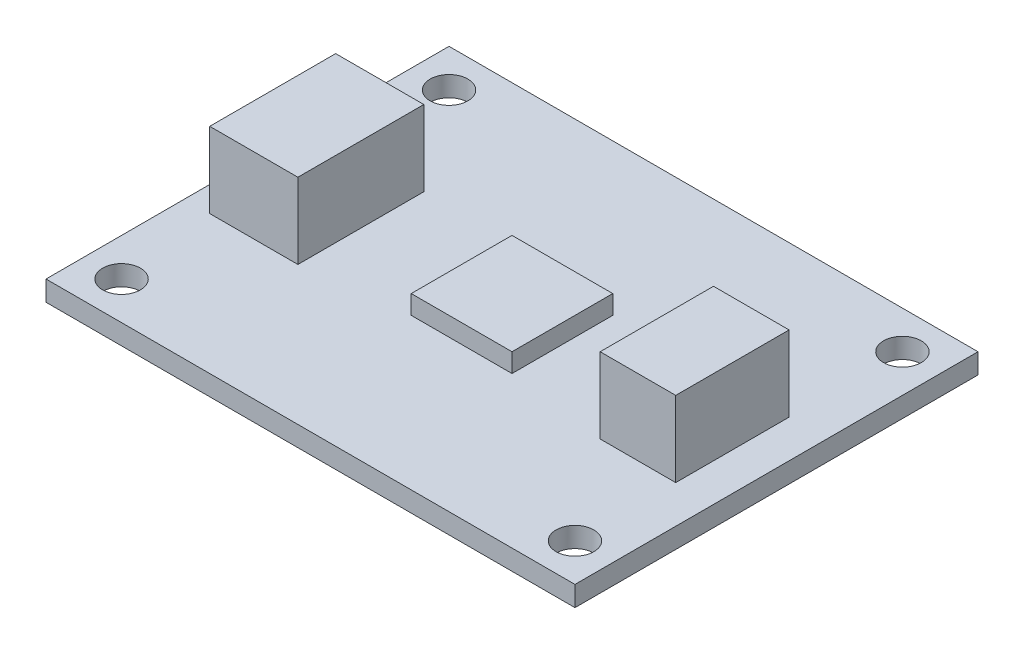
ISO-10303-21;
HEADER;
FILE_DESCRIPTION(('STEP AP214'),'2;1');
FILE_NAME('part.step','',(''),(''),'','','');
FILE_SCHEMA(('AUTOMOTIVE_DESIGN { 1 0 10303 214 1 1 1 1 }'));
ENDSEC;
DATA;
#1=APPLICATION_CONTEXT('core data for automotive mechanical design processes');
#2=APPLICATION_PROTOCOL_DEFINITION('international standard','automotive_design',2000,#1);
#3=PRODUCT_CONTEXT('',#1,'mechanical');
#4=PRODUCT('Part','Part','',(#3));
#5=PRODUCT_RELATED_PRODUCT_CATEGORY('part','',(#4));
#6=PRODUCT_DEFINITION_FORMATION('','',#4);
#7=PRODUCT_DEFINITION_CONTEXT('part definition',#1,'design');
#8=PRODUCT_DEFINITION('design','',#6,#7);
#9=PRODUCT_DEFINITION_SHAPE('','',#8);
#10=(LENGTH_UNIT() NAMED_UNIT(*) SI_UNIT(.MILLI.,.METRE.));
#11=(NAMED_UNIT(*) PLANE_ANGLE_UNIT() SI_UNIT($,.RADIAN.));
#12=(NAMED_UNIT(*) SI_UNIT($,.STERADIAN.) SOLID_ANGLE_UNIT());
#13=UNCERTAINTY_MEASURE_WITH_UNIT(LENGTH_MEASURE(1.E-05),#10,'distance_accuracy_value','');
#14=(GEOMETRIC_REPRESENTATION_CONTEXT(3) GLOBAL_UNCERTAINTY_ASSIGNED_CONTEXT((#13)) GLOBAL_UNIT_ASSIGNED_CONTEXT((#10,
#11,#12)) REPRESENTATION_CONTEXT('',''));
#15=CARTESIAN_POINT('',(0.,0.,0.));
#16=DIRECTION('',(0.,0.,1.));
#17=DIRECTION('',(1.,0.,0.));
#18=AXIS2_PLACEMENT_3D('',#15,#16,#17);
#19=CARTESIAN_POINT('',(0.,1.6,0.));
#20=DIRECTION('',(0.,-1.,0.));
#21=DIRECTION('',(0.,0.,-1.));
#22=AXIS2_PLACEMENT_3D('',#19,#20,#21);
#23=PLANE('',#22);
#24=DIRECTION('',(0.,0.,1.));
#25=VECTOR('',#24,1.);
#26=CARTESIAN_POINT('',(33.,1.6,-11.));
#27=LINE('',#26,#25);
#28=CARTESIAN_POINT('',(33.,1.6,-20.));
#29=VERTEX_POINT('',#28);
#30=CARTESIAN_POINT('',(33.,1.6,-11.));
#31=VERTEX_POINT('',#30);
#32=EDGE_CURVE('E194',#29,#31,#27,.T.);
#33=ORIENTED_EDGE('',*,*,#32,.F.);
#34=DIRECTION('',(-1.,0.,0.));
#35=VECTOR('',#34,1.);
#36=CARTESIAN_POINT('',(33.,1.6,-20.));
#37=LINE('',#36,#35);
#38=CARTESIAN_POINT('',(39.,1.6,-20.));
#39=VERTEX_POINT('',#38);
#40=EDGE_CURVE('E210',#39,#29,#37,.T.);
#41=ORIENTED_EDGE('',*,*,#40,.F.);
#42=DIRECTION('',(0.,0.,-1.));
#43=VECTOR('',#42,1.);
#44=CARTESIAN_POINT('',(39.,1.6,-11.));
#45=LINE('',#44,#43);
#46=CARTESIAN_POINT('',(39.,1.6,-11.));
#47=VERTEX_POINT('',#46);
#48=EDGE_CURVE('E219',#47,#39,#45,.T.);
#49=ORIENTED_EDGE('',*,*,#48,.F.);
#50=DIRECTION('',(1.,0.,0.));
#51=VECTOR('',#50,1.);
#52=CARTESIAN_POINT('',(33.,1.6,-11.));
#53=LINE('',#52,#51);
#54=EDGE_CURVE('E198',#31,#47,#53,.T.);
#55=ORIENTED_EDGE('',*,*,#54,.F.);
#56=EDGE_LOOP('',(#33,#41,#49,#55));
#57=FACE_BOUND('',#56,.T.);
#58=DIRECTION('',(0.,0.,1.));
#59=VECTOR('',#58,1.);
#60=CARTESIAN_POINT('',(0.,1.6,0.));
#61=LINE('',#60,#59);
#62=CARTESIAN_POINT('',(0.,1.6,-32.));
#63=VERTEX_POINT('',#62);
#64=CARTESIAN_POINT('',(0.,1.6,0.));
#65=VERTEX_POINT('',#64);
#66=EDGE_CURVE('E322',#63,#65,#61,.T.);
#67=ORIENTED_EDGE('',*,*,#66,.T.);
#68=DIRECTION('',(1.,0.,0.));
#69=VECTOR('',#68,1.);
#70=CARTESIAN_POINT('',(0.,1.6,0.));
#71=LINE('',#70,#69);
#72=CARTESIAN_POINT('',(42.,1.6,0.));
#73=VERTEX_POINT('',#72);
#74=EDGE_CURVE('E398',#65,#73,#71,.T.);
#75=ORIENTED_EDGE('',*,*,#74,.T.);
#76=DIRECTION('',(0.,0.,-1.));
#77=VECTOR('',#76,1.);
#78=CARTESIAN_POINT('',(42.,1.6,0.));
#79=LINE('',#78,#77);
#80=CARTESIAN_POINT('',(42.,1.6,-32.));
#81=VERTEX_POINT('',#80);
#82=EDGE_CURVE('E372',#73,#81,#79,.T.);
#83=ORIENTED_EDGE('',*,*,#82,.T.);
#84=DIRECTION('',(-1.,0.,0.));
#85=VECTOR('',#84,1.);
#86=CARTESIAN_POINT('',(0.,1.6,-32.));
#87=LINE('',#86,#85);
#88=EDGE_CURVE('E393',#81,#63,#87,.T.);
#89=ORIENTED_EDGE('',*,*,#88,.T.);
#90=EDGE_LOOP('',(#67,#75,#83,#89));
#91=FACE_BOUND('',#90,.T.);
#92=CARTESIAN_POINT('',(3.,1.6,-3.));
#93=DIRECTION('',(0.,1.,0.));
#94=DIRECTION('',(0.,0.,1.));
#95=AXIS2_PLACEMENT_3D('',#92,#93,#94);
#96=CIRCLE('',#95,1.5);
#97=CARTESIAN_POINT('',(3.,1.6,-1.5));
#98=VERTEX_POINT('',#97);
#99=EDGE_CURVE('E313',#98,#98,#96,.T.);
#100=ORIENTED_EDGE('',*,*,#99,.F.);
#101=EDGE_LOOP('',(#100));
#102=FACE_BOUND('',#101,.T.);
#103=CARTESIAN_POINT('',(39.,1.6,-3.));
#104=DIRECTION('',(0.,1.,0.));
#105=DIRECTION('',(0.,0.,1.));
#106=AXIS2_PLACEMENT_3D('',#103,#104,#105);
#107=CIRCLE('',#106,1.5);
#108=CARTESIAN_POINT('',(39.,1.6,-1.5));
#109=VERTEX_POINT('',#108);
#110=EDGE_CURVE('E305',#109,#109,#107,.T.);
#111=ORIENTED_EDGE('',*,*,#110,.F.);
#112=EDGE_LOOP('',(#111));
#113=FACE_BOUND('',#112,.T.);
#114=CARTESIAN_POINT('',(3.,1.6,-29.));
#115=DIRECTION('',(0.,1.,0.));
#116=DIRECTION('',(0.,0.,1.));
#117=AXIS2_PLACEMENT_3D('',#114,#115,#116);
#118=CIRCLE('',#117,1.5);
#119=CARTESIAN_POINT('',(3.,1.6,-27.5));
#120=VERTEX_POINT('',#119);
#121=EDGE_CURVE('E293',#120,#120,#118,.T.);
#122=ORIENTED_EDGE('',*,*,#121,.F.);
#123=EDGE_LOOP('',(#122));
#124=FACE_BOUND('',#123,.T.);
#125=CARTESIAN_POINT('',(39.,1.6,-29.));
#126=DIRECTION('',(0.,1.,0.));
#127=DIRECTION('',(0.,0.,1.));
#128=AXIS2_PLACEMENT_3D('',#125,#126,#127);
#129=CIRCLE('',#128,1.5);
#130=CARTESIAN_POINT('',(39.,1.6,-27.5));
#131=VERTEX_POINT('',#130);
#132=EDGE_CURVE('E286',#131,#131,#129,.T.);
#133=ORIENTED_EDGE('',*,*,#132,.F.);
#134=EDGE_LOOP('',(#133));
#135=FACE_BOUND('',#134,.T.);
#136=DIRECTION('',(0.,0.,1.));
#137=VECTOR('',#136,1.);
#138=CARTESIAN_POINT('',(2.,1.6,-11.));
#139=LINE('',#138,#137);
#140=CARTESIAN_POINT('',(2.,1.6,-21.));
#141=VERTEX_POINT('',#140);
#142=CARTESIAN_POINT('',(2.,1.6,-11.));
#143=VERTEX_POINT('',#142);
#144=EDGE_CURVE('E244',#141,#143,#139,.T.);
#145=ORIENTED_EDGE('',*,*,#144,.F.);
#146=DIRECTION('',(-1.,0.,0.));
#147=VECTOR('',#146,1.);
#148=CARTESIAN_POINT('',(2.,1.6,-21.));
#149=LINE('',#148,#147);
#150=CARTESIAN_POINT('',(9.,1.6,-21.));
#151=VERTEX_POINT('',#150);
#152=EDGE_CURVE('E250',#151,#141,#149,.T.);
#153=ORIENTED_EDGE('',*,*,#152,.F.);
#154=DIRECTION('',(0.,0.,-1.));
#155=VECTOR('',#154,1.);
#156=CARTESIAN_POINT('',(9.,1.6,-11.));
#157=LINE('',#156,#155);
#158=CARTESIAN_POINT('',(9.,1.6,-11.));
#159=VERTEX_POINT('',#158);
#160=EDGE_CURVE('E264',#159,#151,#157,.T.);
#161=ORIENTED_EDGE('',*,*,#160,.F.);
#162=DIRECTION('',(1.,0.,0.));
#163=VECTOR('',#162,1.);
#164=CARTESIAN_POINT('',(2.,1.6,-11.));
#165=LINE('',#164,#163);
#166=EDGE_CURVE('E261',#143,#159,#165,.T.);
#167=ORIENTED_EDGE('',*,*,#166,.F.);
#168=EDGE_LOOP('',(#145,#153,#161,#167));
#169=FACE_BOUND('',#168,.T.);
#170=DIRECTION('',(0.,0.,1.));
#171=VECTOR('',#170,1.);
#172=CARTESIAN_POINT('',(17.,1.6,-12.));
#173=LINE('',#172,#171);
#174=CARTESIAN_POINT('',(17.,1.6,-20.));
#175=VERTEX_POINT('',#174);
#176=CARTESIAN_POINT('',(17.,1.6,-12.));
#177=VERTEX_POINT('',#176);
#178=EDGE_CURVE('E190',#175,#177,#173,.T.);
#179=ORIENTED_EDGE('',*,*,#178,.F.);
#180=DIRECTION('',(-1.,0.,0.));
#181=VECTOR('',#180,1.);
#182=CARTESIAN_POINT('',(17.,1.6,-20.));
#183=LINE('',#182,#181);
#184=CARTESIAN_POINT('',(25.,1.6,-20.));
#185=VERTEX_POINT('',#184);
#186=EDGE_CURVE('E188',#185,#175,#183,.T.);
#187=ORIENTED_EDGE('',*,*,#186,.F.);
#188=DIRECTION('',(0.,0.,-1.));
#189=VECTOR('',#188,1.);
#190=CARTESIAN_POINT('',(25.,1.6,-12.));
#191=LINE('',#190,#189);
#192=CARTESIAN_POINT('',(25.,1.6,-12.));
#193=VERTEX_POINT('',#192);
#194=EDGE_CURVE('E74',#193,#185,#191,.T.);
#195=ORIENTED_EDGE('',*,*,#194,.F.);
#196=DIRECTION('',(1.,0.,0.));
#197=VECTOR('',#196,1.);
#198=CARTESIAN_POINT('',(17.,1.6,-12.));
#199=LINE('',#198,#197);
#200=EDGE_CURVE('E68',#177,#193,#199,.T.);
#201=ORIENTED_EDGE('',*,*,#200,.F.);
#202=EDGE_LOOP('',(#179,#187,#195,#201));
#203=FACE_BOUND('',#202,.T.);
#204=ADVANCED_FACE('F47',(#57,#91,#102,#113,#124,#135,#169,#203),#23,.F.);
#205=CARTESIAN_POINT('',(0.,0.,0.));
#206=DIRECTION('',(0.,-1.,0.));
#207=DIRECTION('',(0.,0.,-1.));
#208=AXIS2_PLACEMENT_3D('',#205,#206,#207);
#209=PLANE('',#208);
#210=CARTESIAN_POINT('',(39.,0.,-29.));
#211=DIRECTION('',(0.,-1.,0.));
#212=DIRECTION('',(0.,0.,-1.));
#213=AXIS2_PLACEMENT_3D('',#210,#211,#212);
#214=CIRCLE('',#213,1.5);
#215=CARTESIAN_POINT('',(39.,0.,-30.5));
#216=VERTEX_POINT('',#215);
#217=EDGE_CURVE('E292',#216,#216,#214,.T.);
#218=ORIENTED_EDGE('',*,*,#217,.F.);
#219=EDGE_LOOP('',(#218));
#220=FACE_BOUND('',#219,.T.);
#221=CARTESIAN_POINT('',(3.,0.,-29.));
#222=DIRECTION('',(0.,-1.,0.));
#223=DIRECTION('',(0.,0.,-1.));
#224=AXIS2_PLACEMENT_3D('',#221,#222,#223);
#225=CIRCLE('',#224,1.5);
#226=CARTESIAN_POINT('',(3.,0.,-30.5));
#227=VERTEX_POINT('',#226);
#228=EDGE_CURVE('E300',#227,#227,#225,.T.);
#229=ORIENTED_EDGE('',*,*,#228,.F.);
#230=EDGE_LOOP('',(#229));
#231=FACE_BOUND('',#230,.T.);
#232=CARTESIAN_POINT('',(39.,0.,-3.));
#233=DIRECTION('',(0.,-1.,0.));
#234=DIRECTION('',(0.,0.,-1.));
#235=AXIS2_PLACEMENT_3D('',#232,#233,#234);
#236=CIRCLE('',#235,1.5);
#237=CARTESIAN_POINT('',(39.,0.,-4.5));
#238=VERTEX_POINT('',#237);
#239=EDGE_CURVE('E307',#238,#238,#236,.T.);
#240=ORIENTED_EDGE('',*,*,#239,.F.);
#241=EDGE_LOOP('',(#240));
#242=FACE_BOUND('',#241,.T.);
#243=DIRECTION('',(0.,0.,1.));
#244=VECTOR('',#243,1.);
#245=CARTESIAN_POINT('',(0.,0.,0.));
#246=LINE('',#245,#244);
#247=CARTESIAN_POINT('',(0.,0.,-32.));
#248=VERTEX_POINT('',#247);
#249=CARTESIAN_POINT('',(0.,0.,0.));
#250=VERTEX_POINT('',#249);
#251=EDGE_CURVE('E367',#248,#250,#246,.T.);
#252=ORIENTED_EDGE('',*,*,#251,.F.);
#253=DIRECTION('',(-1.,0.,0.));
#254=VECTOR('',#253,1.);
#255=CARTESIAN_POINT('',(0.,0.,-32.));
#256=LINE('',#255,#254);
#257=CARTESIAN_POINT('',(42.,0.,-32.));
#258=VERTEX_POINT('',#257);
#259=EDGE_CURVE('E379',#258,#248,#256,.T.);
#260=ORIENTED_EDGE('',*,*,#259,.F.);
#261=DIRECTION('',(0.,0.,-1.));
#262=VECTOR('',#261,1.);
#263=CARTESIAN_POINT('',(42.,0.,0.));
#264=LINE('',#263,#262);
#265=CARTESIAN_POINT('',(42.,0.,0.));
#266=VERTEX_POINT('',#265);
#267=EDGE_CURVE('E369',#266,#258,#264,.T.);
#268=ORIENTED_EDGE('',*,*,#267,.F.);
#269=DIRECTION('',(1.,0.,0.));
#270=VECTOR('',#269,1.);
#271=CARTESIAN_POINT('',(0.,0.,0.));
#272=LINE('',#271,#270);
#273=EDGE_CURVE('E357',#250,#266,#272,.T.);
#274=ORIENTED_EDGE('',*,*,#273,.F.);
#275=EDGE_LOOP('',(#252,#260,#268,#274));
#276=FACE_BOUND('',#275,.T.);
#277=CARTESIAN_POINT('',(3.,0.,-1.5));
#278=CARTESIAN_POINT('',(3.02473476852014,0.,-1.49999808268023));
#279=CARTESIAN_POINT('',(3.04947077852744,0.,-1.50058952088561));
#280=CARTESIAN_POINT('',(3.09871128510791,0.,-1.50297026282923));
#281=CARTESIAN_POINT('',(3.12321619008274,0.,-1.50475115118465));
#282=CARTESIAN_POINT('',(3.17199479323884,0.,-1.50951033958627));
#283=CARTESIAN_POINT('',(3.19626903668255,0.,-1.51248303012231));
#284=CARTESIAN_POINT('',(3.24458604299877,0.,-1.5196223185799));
#285=CARTESIAN_POINT('',(3.26862920150858,0.,-1.52378623784495));
#286=CARTESIAN_POINT('',(3.31648427918397,0.,-1.53330520126869));
#287=CARTESIAN_POINT('',(3.34029614420105,0.,-1.53866051765186));
#288=CARTESIAN_POINT('',(3.38768916255076,0.,-1.55055914535936));
#289=CARTESIAN_POINT('',(3.41126952247919,0.,-1.55710561520425));
#290=CARTESIAN_POINT('',(3.45820019306473,0.,-1.5713841370317));
#291=CARTESIAN_POINT('',(3.48154870748097,0.,-1.5791220881609));
#292=CARTESIAN_POINT('',(3.52801723618728,0.,-1.5957791895752));
#293=CARTESIAN_POINT('',(3.55113423399136,0.,-1.6047067440334));
#294=CARTESIAN_POINT('',(3.59686336053345,0.,-1.62363284620259));
#295=CARTESIAN_POINT('',(3.61947652911213,0.,-1.63362888080482));
#296=CARTESIAN_POINT('',(3.66403406458071,0.,-1.65464604475005));
#297=CARTESIAN_POINT('',(3.68598193419856,0.,-1.66565973959498));
#298=CARTESIAN_POINT('',(3.72921011776678,0.,-1.68870787016335));
#299=CARTESIAN_POINT('',(3.75049296316448,0.,-1.70073755627143));
#300=CARTESIAN_POINT('',(3.79239200246155,0.,-1.72581538149841));
#301=CARTESIAN_POINT('',(3.8130094499866,0.,-1.73886142558469));
#302=CARTESIAN_POINT('',(3.85357904909066,0.,-1.76596920312007));
#303=CARTESIAN_POINT('',(3.87353089224214,0.,-1.78003139813391));
#304=CARTESIAN_POINT('',(3.91277098771501,0.,-1.80916884548771));
#305=CARTESIAN_POINT('',(3.9320571299299,0.,-1.82424693880415));
#306=CARTESIAN_POINT('',(3.96996730836346,0.,-1.85541426255289));
#307=CARTESIAN_POINT('',(3.98858724864176,0.,-1.871508472616));
#308=CARTESIAN_POINT('',(4.02516839349344,0.,-1.90470433067737));
#309=CARTESIAN_POINT('',(4.04312341285184,0.,-1.92181278892861));
#310=CARTESIAN_POINT('',(4.07814252919733,0.,-1.95681249615295));
#311=CARTESIAN_POINT('',(4.09520921716559,0.,-1.9747011521588));
#312=CARTESIAN_POINT('',(4.12833220882839,0.,-2.0111697936334));
#313=CARTESIAN_POINT('',(4.14439459506975,0.,-2.02974424957241));
#314=CARTESIAN_POINT('',(4.17551206025699,0.,-2.06758068636725));
#315=CARTESIAN_POINT('',(4.19057129531389,0.,-2.08683924813341));
#316=CARTESIAN_POINT('',(4.21968410022329,0.,-2.12604219746949));
#317=CARTESIAN_POINT('',(4.23373963003813,0.,-2.14598512919456));
#318=CARTESIAN_POINT('',(4.26084735271722,0.,-2.18655476568433));
#319=CARTESIAN_POINT('',(4.27389908400014,0.,-2.2071817788474));
#320=CARTESIAN_POINT('',(4.29900178729554,0.,-2.24911780391281));
#321=CARTESIAN_POINT('',(4.31104972262615,0.,-2.27042863303539));
#322=CARTESIAN_POINT('',(4.33414694196363,0.,-2.31373108289539));
#323=CARTESIAN_POINT('',(4.3451905361943,0.,-2.33572573676181));
#324=CARTESIAN_POINT('',(4.36628360233901,0.,-2.380393708617));
#325=CARTESIAN_POINT('',(4.37632475368795,0.,-2.40307095148041));
#326=CARTESIAN_POINT('',(4.39528439042207,0.,-2.44880770028202));
#327=CARTESIAN_POINT('',(4.40420626184727,0.,-2.47186580215649));
#328=CARTESIAN_POINT('',(4.42085197100997,0.,-2.51823405372999));
#329=CARTESIAN_POINT('',(4.42858354434745,0.,-2.54154142249953));
#330=CARTESIAN_POINT('',(4.44285295603563,0.,-2.58840587042263));
#331=CARTESIAN_POINT('',(4.44939594256118,0.,-2.61196138122405));
#332=CARTESIAN_POINT('',(4.46129034794042,0.,-2.65932117183802));
#333=CARTESIAN_POINT('',(4.4666441346909,0.,-2.68312485667042));
#334=CARTESIAN_POINT('',(4.47616307710533,0.,-2.73097998982324));
#335=CARTESIAN_POINT('',(4.4803276883048,0.,-2.75503154642707));
#336=CARTESIAN_POINT('',(4.48747134007836,0.,-2.80338177031859));
#337=CARTESIAN_POINT('',(4.49044687970416,0.,-2.82768095441102));
#338=CARTESIAN_POINT('',(4.49521479776574,0.,-2.87652612471843));
#339=CARTESIAN_POINT('',(4.49700075880555,0.,-2.90107273579611));
#340=CARTESIAN_POINT('',(4.49939451810823,0.,-2.95041252770326));
#341=CARTESIAN_POINT('',(4.49999312718683,0.,-2.97520615050166));
#342=CARTESIAN_POINT('',(4.50000685149273,0.,-3.0247169354649));
#343=CARTESIAN_POINT('',(4.49942563232503,0.,-3.04943409622542));
#344=CARTESIAN_POINT('',(4.49705990065969,0.,-3.09864281192909));
#345=CARTESIAN_POINT('',(4.49528359914018,0.,-3.12313475791435));
#346=CARTESIAN_POINT('',(4.49053256875276,0.,-3.17189252959563));
#347=CARTESIAN_POINT('',(4.48756319636062,0.,-3.19615887644444));
#348=CARTESIAN_POINT('',(4.48042838681365,0.,-3.24446540953319));
#349=CARTESIAN_POINT('',(4.47626536499926,0.,-3.26850595223802));
#350=CARTESIAN_POINT('',(4.46674635445589,0.,-3.31636107183915));
#351=CARTESIAN_POINT('',(4.46138982126907,0.,-3.34017554041874));
#352=CARTESIAN_POINT('',(4.44948686529562,0.,-3.38757907984477));
#353=CARTESIAN_POINT('',(4.4429370102819,0.,-3.41116728840162));
#354=CARTESIAN_POINT('',(4.42864975476399,0.,-3.45811894475968));
#355=CARTESIAN_POINT('',(4.42090618623438,0.,-3.48148051402763));
#356=CARTESIAN_POINT('',(4.40423621054066,0.,-3.52798058993518));
#357=CARTESIAN_POINT('',(4.39530114454309,0.,-3.55111598835224));
#358=CARTESIAN_POINT('',(4.37636686701957,0.,-3.59686324128279));
#359=CARTESIAN_POINT('',(4.36637104260846,0.,-3.61947649726514));
#360=CARTESIAN_POINT('',(4.34535403131567,0.,-3.66403409621113));
#361=CARTESIAN_POINT('',(4.33434028074328,0.,-3.68598194265587));
#362=CARTESIAN_POINT('',(4.31129210958854,0.,-3.7292101093471));
#363=CARTESIAN_POINT('',(4.29926243830797,0.,-3.75049296091052));
#364=CARTESIAN_POINT('',(4.27418462391109,0.,-3.79239200471108));
#365=CARTESIAN_POINT('',(4.26113857586517,0.,-3.81300945058959));
#366=CARTESIAN_POINT('',(4.23403079542919,0.,-3.8535790484875));
#367=CARTESIAN_POINT('',(4.21996860147668,0.,-3.8735308920803));
#368=CARTESIAN_POINT('',(4.19083115490262,0.,-3.91277098787741));
#369=CARTESIAN_POINT('',(4.17575306130066,0.,-3.93205712997356));
#370=CARTESIAN_POINT('',(4.14458573734158,0.,-3.96996730831963));
#371=CARTESIAN_POINT('',(4.12849152735558,0.,-3.98858724863));
#372=CARTESIAN_POINT('',(4.09529566935117,0.,-4.02516839350533));
#373=CARTESIAN_POINT('',(4.07818721107901,0.,-4.04312341285502));
#374=CARTESIAN_POINT('',(4.04318750383944,0.,-4.07814252919416));
#375=CARTESIAN_POINT('',(4.02529884783919,0.,-4.09520921716475));
#376=CARTESIAN_POINT('',(3.98883020636866,0.,-4.12833220882923));
#377=CARTESIAN_POINT('',(3.97025575042817,0.,-4.14439459506998));
#378=CARTESIAN_POINT('',(3.93241931363226,0.,-4.17551206025677));
#379=CARTESIAN_POINT('',(3.9131607518665,0.,-4.19057129531383));
#380=CARTESIAN_POINT('',(3.87395780253072,0.,-4.21968410022335));
#381=CARTESIAN_POINT('',(3.85401487080554,0.,-4.23373963003815));
#382=CARTESIAN_POINT('',(3.81344523431569,0.,-4.2608473527172));
#383=CARTESIAN_POINT('',(3.79281822115265,0.,-4.27389908400013));
#384=CARTESIAN_POINT('',(3.75088219608725,0.,-4.29900178729554));
#385=CARTESIAN_POINT('',(3.72957136696466,0.,-4.31104972262615));
#386=CARTESIAN_POINT('',(3.68626891710464,0.,-4.33414694196363));
#387=CARTESIAN_POINT('',(3.66427426323822,0.,-4.3451905361943));
#388=CARTESIAN_POINT('',(3.61960629138302,0.,-4.36628360233901));
#389=CARTESIAN_POINT('',(3.5969290485196,0.,-4.37632475368795));
#390=CARTESIAN_POINT('',(3.55119229971797,0.,-4.39528439042207));
#391=CARTESIAN_POINT('',(3.5281341978435,0.,-4.40420626184726));
#392=CARTESIAN_POINT('',(3.48176594626998,0.,-4.42085197100997));
#393=CARTESIAN_POINT('',(3.45845857750043,0.,-4.42858354434745));
#394=CARTESIAN_POINT('',(3.41159412957732,0.,-4.44285295603563));
#395=CARTESIAN_POINT('',(3.3880386187759,0.,-4.44939594256118));
#396=CARTESIAN_POINT('',(3.34067882816192,0.,-4.46129034794042));
#397=CARTESIAN_POINT('',(3.31687514332952,0.,-4.4666441346909));
#398=CARTESIAN_POINT('',(3.2690200101767,0.,-4.47616307710533));
#399=CARTESIAN_POINT('',(3.24496845357287,0.,-4.4803276883048));
#400=CARTESIAN_POINT('',(3.19661822968136,0.,-4.48747134007836));
#401=CARTESIAN_POINT('',(3.17231904558893,0.,-4.49044687970416));
#402=CARTESIAN_POINT('',(3.12347387528153,0.,-4.49521479776574));
#403=CARTESIAN_POINT('',(3.09892726420385,0.,-4.49700075880555));
#404=CARTESIAN_POINT('',(3.04958747229672,0.,-4.49939451810823));
#405=CARTESIAN_POINT('',(3.02479384949834,0.,-4.49999312718683));
#406=CARTESIAN_POINT('',(2.97528306453511,0.,-4.50000685149273));
#407=CARTESIAN_POINT('',(2.9505659037746,0.,-4.49942563232503));
#408=CARTESIAN_POINT('',(2.90135718807094,0.,-4.49705990065969));
#409=CARTESIAN_POINT('',(2.87686524208568,0.,-4.49528359914018));
#410=CARTESIAN_POINT('',(2.82810747040442,0.,-4.49053256875276));
#411=CARTESIAN_POINT('',(2.80384112355561,0.,-4.48756319636062));
#412=CARTESIAN_POINT('',(2.75553459046687,0.,-4.48042838681365));
#413=CARTESIAN_POINT('',(2.73149404776204,0.,-4.47626536499926));
#414=CARTESIAN_POINT('',(2.68363892816091,0.,-4.46674635445589));
#415=CARTESIAN_POINT('',(2.65982445958132,0.,-4.46138982126907));
#416=CARTESIAN_POINT('',(2.61242092015528,0.,-4.44948686529562));
#417=CARTESIAN_POINT('',(2.58883271159843,0.,-4.4429370102819));
#418=CARTESIAN_POINT('',(2.54188105524036,0.,-4.42864975476398));
#419=CARTESIAN_POINT('',(2.5185194859724,0.,-4.42090618623437));
#420=CARTESIAN_POINT('',(2.47201941006484,0.,-4.40423621054066));
#421=CARTESIAN_POINT('',(2.44888401164777,0.,-4.39530114454309));
#422=CARTESIAN_POINT('',(2.4031367587172,0.,-4.37636686701957));
#423=CARTESIAN_POINT('',(2.38052350273484,0.,-4.36637104260846));
#424=CARTESIAN_POINT('',(2.33596590378883,0.,-4.34535403131567));
#425=CARTESIAN_POINT('',(2.31401805734409,0.,-4.33434028074328));
#426=CARTESIAN_POINT('',(2.27078989065285,0.,-4.31129210958854));
#427=CARTESIAN_POINT('',(2.24950703908942,0.,-4.29926243830797));
#428=CARTESIAN_POINT('',(2.20760799528886,0.,-4.27418462391109));
#429=CARTESIAN_POINT('',(2.18699054941035,0.,-4.26113857586517));
#430=CARTESIAN_POINT('',(2.14642095151244,0.,-4.23403079542919));
#431=CARTESIAN_POINT('',(2.12646910791964,0.,-4.21996860147668));
#432=CARTESIAN_POINT('',(2.08722901212253,0.,-4.19083115490262));
#433=CARTESIAN_POINT('',(2.06794287002639,0.,-4.17575306130066));
#434=CARTESIAN_POINT('',(2.03003269168033,0.,-4.14458573734158));
#435=CARTESIAN_POINT('',(2.01141275136997,0.,-4.12849152735558));
#436=CARTESIAN_POINT('',(1.97483160649465,0.,-4.09529566935117));
#437=CARTESIAN_POINT('',(1.95687658714497,0.,-4.07818721107901));
#438=CARTESIAN_POINT('',(1.92185747080584,0.,-4.04318750383943));
#439=CARTESIAN_POINT('',(1.90479078283525,0.,-4.02529884783916));
#440=CARTESIAN_POINT('',(1.87166779117076,0.,-3.98883020636862));
#441=CARTESIAN_POINT('',(1.85560540493001,0.,-3.97025575042812));
#442=CARTESIAN_POINT('',(1.82448793974322,0.,-3.9324193136322));
#443=CARTESIAN_POINT('',(1.80942870468616,0.,-3.91316075186643));
#444=CARTESIAN_POINT('',(1.78031589977663,0.,-3.87395780253064));
#445=CARTESIAN_POINT('',(1.76626036996183,0.,-3.85401487080546));
#446=CARTESIAN_POINT('',(1.73915264728278,0.,-3.81344523431561));
#447=CARTESIAN_POINT('',(1.72610091599985,0.,-3.79281822115257));
#448=CARTESIAN_POINT('',(1.70099821270444,0.,-3.75088219608718));
#449=CARTESIAN_POINT('',(1.68895027737383,0.,-3.7295713669646));
#450=CARTESIAN_POINT('',(1.66585305803636,0.,-3.68626891710459));
#451=CARTESIAN_POINT('',(1.65480946380569,0.,-3.66427426323818));
#452=CARTESIAN_POINT('',(1.63371639766099,0.,-3.619606291383));
#453=CARTESIAN_POINT('',(1.62367524631205,0.,-3.59692904851959));
#454=CARTESIAN_POINT('',(1.60471560957792,0.,-3.55119229971796));
#455=CARTESIAN_POINT('',(1.59579373815272,0.,-3.52813419784346));
#456=CARTESIAN_POINT('',(1.57914802899,0.,-3.48176594626992));
#457=CARTESIAN_POINT('',(1.57141645565251,0.,-3.45845857750036));
#458=CARTESIAN_POINT('',(1.55714704396432,0.,-3.41159412957723));
#459=CARTESIAN_POINT('',(1.55060405743877,0.,-3.3880386187758));
#460=CARTESIAN_POINT('',(1.53870965205952,0.,-3.34067882816182));
#461=CARTESIAN_POINT('',(1.53335586530904,0.,-3.31687514332941));
#462=CARTESIAN_POINT('',(1.52383692289461,0.,-3.26902001017659));
#463=CARTESIAN_POINT('',(1.51967231169514,0.,-3.24496845357277));
#464=CARTESIAN_POINT('',(1.51252865992158,0.,-3.19661822968126));
#465=CARTESIAN_POINT('',(1.50955312029579,0.,-3.17231904558884));
#466=CARTESIAN_POINT('',(1.50478520223422,0.,-3.12347387528146));
#467=CARTESIAN_POINT('',(1.50299924119442,0.,-3.09892726420379));
#468=CARTESIAN_POINT('',(1.50060548189175,0.,-3.04958747229669));
#469=CARTESIAN_POINT('',(1.50000687281316,0.,-3.02479384949832));
#470=CARTESIAN_POINT('',(1.49999314850728,0.,-2.97528306453511));
#471=CARTESIAN_POINT('',(1.50057436767499,0.,-2.9505659037746));
#472=CARTESIAN_POINT('',(1.50294009934035,0.,-2.90135718807094));
#473=CARTESIAN_POINT('',(1.50471640085986,0.,-2.87686524208569));
#474=CARTESIAN_POINT('',(1.50946743124729,0.,-2.82810747040442));
#475=CARTESIAN_POINT('',(1.51243680363943,0.,-2.80384112355561));
#476=CARTESIAN_POINT('',(1.51957161318641,0.,-2.75553459046687));
#477=CARTESIAN_POINT('',(1.52373463500081,0.,-2.73149404776204));
#478=CARTESIAN_POINT('',(1.53325364554417,0.,-2.68363892816091));
#479=CARTESIAN_POINT('',(1.53861017873099,0.,-2.65982445958132));
#480=CARTESIAN_POINT('',(1.55051313470444,0.,-2.61242092015528));
#481=CARTESIAN_POINT('',(1.55706298971815,0.,-2.58883271159843));
#482=CARTESIAN_POINT('',(1.57135024523606,0.,-2.54188105524036));
#483=CARTESIAN_POINT('',(1.57909381376566,0.,-2.5185194859724));
#484=CARTESIAN_POINT('',(1.59576378945936,0.,-2.47201941006484));
#485=CARTESIAN_POINT('',(1.60469885545692,0.,-2.44888401164777));
#486=CARTESIAN_POINT('',(1.62363313298042,0.,-2.4031367587172));
#487=CARTESIAN_POINT('',(1.63362895739152,0.,-2.38052350273482));
#488=CARTESIAN_POINT('',(1.65464596868431,0.,-2.33596590378881));
#489=CARTESIAN_POINT('',(1.66565971925669,0.,-2.31401805734406));
#490=CARTESIAN_POINT('',(1.68870789041143,0.,-2.27078989065281));
#491=CARTESIAN_POINT('',(1.70073756169199,0.,-2.24950703908937));
#492=CARTESIAN_POINT('',(1.72581537608887,0.,-2.20760799528882));
#493=CARTESIAN_POINT('',(1.73886142413481,0.,-2.18699054941034));
#494=CARTESIAN_POINT('',(1.76596920457076,0.,-2.14642095151235));
#495=CARTESIAN_POINT('',(1.78003139852322,0.,-2.12646910791944));
#496=CARTESIAN_POINT('',(1.8091688450974,0.,-2.08722901212263));
#497=CARTESIAN_POINT('',(1.82424693869953,0.,-2.06794287002689));
#498=CARTESIAN_POINT('',(1.85541426265817,0.,-2.03003269167975));
#499=CARTESIAN_POINT('',(1.87150847264355,0.,-2.0114127513679));
#500=CARTESIAN_POINT('',(1.90470433064967,0.,-1.97483160649669));
#501=CARTESIAN_POINT('',(1.9218127889242,0.,-1.95687658715267));
#502=CARTESIAN_POINT('',(1.95681249615738,0.,-1.92185747079815));
#503=CARTESIAN_POINT('',(1.97470115214892,0.,-1.9047907828066));
#504=CARTESIAN_POINT('',(2.01116979364331,0.,-1.87166779119921));
#505=CARTESIAN_POINT('',(2.02974424961609,0.,-1.85560540503586));
#506=CARTESIAN_POINT('',(2.06758068632395,0.,-1.82448793963782));
#507=CARTESIAN_POINT('',(2.08683924797005,0.,-1.80942870429375));
#508=CARTESIAN_POINT('',(2.12604219763274,0.,-1.78031590016823));
#509=CARTESIAN_POINT('',(2.14598512980335,0.,-1.76626037142173));
#510=CARTESIAN_POINT('',(2.18655476507551,0.,-1.73915264582219));
#511=CARTESIAN_POINT('',(2.20718177657448,0.,-1.72610091054817));
#512=CARTESIAN_POINT('',(2.24911780619261,0.,-1.70099821817204));
#513=CARTESIAN_POINT('',(2.27042864155506,0.,-1.68895029780708));
#514=CARTESIAN_POINT('',(2.31373107433031,0.,-1.66585303749374));
#515=CARTESIAN_POINT('',(2.33572570471369,0.,-1.65480938694163));
#516=CARTESIAN_POINT('',(2.38039374091229,0.,-1.63371647511762));
#517=CARTESIAN_POINT('',(2.40307107246168,0.,-1.62367553647231));
#518=CARTESIAN_POINT('',(2.44882597408161,0.,-1.60470769485781));
#519=CARTESIAN_POINT('',(2.47190250413238,0.,-1.59577828376425));
#520=CARTESIAN_POINT('',(2.51830235185531,0.,-1.57911965385198));
#521=CARTESIAN_POINT('',(2.54162279569865,0.,-1.57138244189938));
#522=CARTESIAN_POINT('',(2.58850826063015,0.,-1.5571042684096));
#523=CARTESIAN_POINT('',(2.61207163070072,0.,-1.55055788851869));
#524=CARTESIAN_POINT('',(2.65944196283215,0.,-1.53865912927032));
#525=CARTESIAN_POINT('',(2.68324826081642,0.,-1.5333041075351));
#526=CARTESIAN_POINT('',(2.73110342111074,0.,-1.52378515642614));
#527=CARTESIAN_POINT('',(2.75515233756671,0.,-1.51962149930581));
#528=CARTESIAN_POINT('',(2.80349212816829,0.,-1.51248219794092));
#529=CARTESIAN_POINT('',(2.82778348028029,0.,-1.50950979165428));
#530=CARTESIAN_POINT('',(2.87660757695443,0.,-1.50475060114369));
#531=CARTESIAN_POINT('',(2.90114092052312,0.,-1.50296998702458));
#532=CARTESIAN_POINT('',(2.95044966261457,0.,-1.50058925681204));
#533=CARTESIAN_POINT('',(2.97522549562095,0.,-1.49999810349527));
#534=CARTESIAN_POINT('',(3.,0.,-1.5));
#535=B_SPLINE_CURVE_WITH_KNOTS('',3,(#277,#278,#279,#280,#281,#282,#283,#284,#285,#286,#287,
#288,#289,#290,#291,#292,#293,#294,#295,#296,#297,#298,#299,#300,#301,#302,#303,#304,#305,#306,
#307,#308,#309,#310,#311,#312,#313,#314,#315,#316,#317,#318,#319,#320,#321,#322,#323,#324,#325,
#326,#327,#328,#329,#330,#331,#332,#333,#334,#335,#336,#337,#338,#339,#340,#341,#342,#343,#344,
#345,#346,#347,#348,#349,#350,#351,#352,#353,#354,#355,#356,#357,#358,#359,#360,#361,#362,#363,
#364,#365,#366,#367,#368,#369,#370,#371,#372,#373,#374,#375,#376,#377,#378,#379,#380,#381,#382,
#383,#384,#385,#386,#387,#388,#389,#390,#391,#392,#393,#394,#395,#396,#397,#398,#399,#400,#401,
#402,#403,#404,#405,#406,#407,#408,#409,#410,#411,#412,#413,#414,#415,#416,#417,#418,#419,#420,
#421,#422,#423,#424,#425,#426,#427,#428,#429,#430,#431,#432,#433,#434,#435,#436,#437,#438,#439,
#440,#441,#442,#443,#444,#445,#446,#447,#448,#449,#450,#451,#452,#453,#454,#455,#456,#457,#458,
#459,#460,#461,#462,#463,#464,#465,#466,#467,#468,#469,#470,#471,#472,#473,#474,#475,#476,#477,
#478,#479,#480,#481,#482,#483,#484,#485,#486,#487,#488,#489,#490,#491,#492,#493,#494,#495,#496,
#497,#498,#499,#500,#501,#502,#503,#504,#505,#506,#507,#508,#509,#510,#511,#512,#513,#514,#515,
#516,#517,#518,#519,#520,#521,#522,#523,#524,#525,#526,#527,#528,#529,#530,#531,#532,#533,#534),
.UNSPECIFIED.,.F.,.F.,(4,2,2,2,2,2,2,2,2,2,2,2,2,2,2,2,2,2,2,2,2,2,2,2,2,2,2,2,2,2,2,2,2,2,2,2,
2,2,2,2,2,2,2,2,2,2,2,2,2,2,2,2,2,2,2,2,2,2,2,2,2,2,2,2,2,2,2,2,2,2,2,2,2,2,2,2,2,2,2,2,2,2,2,2,
2,2,2,2,2,2,2,2,2,2,2,2,2,2,2,2,2,2,2,2,2,2,2,2,2,2,2,2,2,2,2,2,2,2,2,2,2,2,2,2,2,2,2,2,4),(0.,
0.0741989708048556,0.147878466158454,0.221215167441637,0.294388239176489,0.367578047562669,
0.440964835396546,0.51472740149901,0.589041832398688,0.663185166528906,0.73682422143744,
0.810136292194045,0.883301050980933,0.956499254763454,1.02991141346046,1.10371646715628,
1.17809052013483,1.25223385426508,1.32587290917364,1.39918497993025,1.47234973871715,
1.54554794249966,1.61896010119666,1.69276515489246,1.76713920787098,1.84128254200124,
1.9149215969098,1.98823366766642,2.06139842645331,2.13459663023583,2.20800878893282,
2.28181384262861,2.35618789560712,2.43033122973745,2.50397028464606,2.57728235540271,
2.65044711418961,2.72364531797212,2.79705747666908,2.87086253036483,2.94523658334327,
3.01937991747353,3.0930189723821,3.16633104313872,3.23949580192562,3.31269400570813,
3.38610616440512,3.4599112181009,3.5342852710794,3.60842860520963,3.68206766011817,
3.75537973087478,3.82854448966167,3.90174269344419,3.97515485214119,4.04895990583702,
4.12333395881556,4.19747729294584,4.27111634785442,4.34442841861105,4.41759317739795,
4.49079138118046,4.56420353987744,4.63800859357321,4.71238264655169,4.78652598068199,
4.86016503559059,4.93347710634723,5.00664186513413,5.07984006891664,5.15325222761361,
5.22705728130938,5.30143133428785,5.37557466841813,5.44921372332671,5.52252579408335,
5.59569055287024,5.66888875665276,5.74230091534973,5.8161059690455,5.89048002202398,
5.96462335615424,6.0382624110628,6.11157448181943,6.18473924060632,6.25793744438884,
6.33134960308583,6.40515465678162,6.47952870976013,6.55367204389047,6.62731109879909,
6.70062316955575,6.77378792834265,6.84698613212515,6.92039829082211,6.99420334451785,
7.06857739749627,7.14272073162658,7.21635978653517,7.28967185729181,7.36283661607871,
7.43603481986122,7.50944697855819,7.58325203225395,7.65762608523241,7.73176941936271,
7.8054084742713,7.87872054502794,7.95188530381484,8.02508350759735,8.09849566629433,
8.1723007199901,8.24667477296856,8.32081810709886,8.39445716200746,8.4677692327641,
8.540933991551,8.61413219533351,8.68754435403048,8.76134940772624,8.83572346070471,
8.90992652587294,8.98360814499247,9.05694563133222,9.13011879991219,9.20330867686439,
9.27669616467646,9.35046071196917,9.42477903607618),.UNSPECIFIED.);
#536=CARTESIAN_POINT('',(3.,0.,-1.5));
#537=VERTEX_POINT('',#536);
#538=EDGE_CURVE('E312',#537,#537,#535,.T.);
#539=ORIENTED_EDGE('',*,*,#538,.T.);
#540=EDGE_LOOP('',(#539));
#541=FACE_BOUND('',#540,.T.);
#542=ADVANCED_FACE('F336',(#220,#231,#242,#276,#541),#209,.T.);
#543=CARTESIAN_POINT('',(0.,1.6,0.));
#544=DIRECTION('',(1.,0.,0.));
#545=DIRECTION('',(0.,0.,-1.));
#546=AXIS2_PLACEMENT_3D('',#543,#544,#545);
#547=PLANE('',#546);
#548=ORIENTED_EDGE('',*,*,#251,.T.);
#549=DIRECTION('',(0.,-1.,0.));
#550=VECTOR('',#549,1.);
#551=CARTESIAN_POINT('',(0.,1.6,0.));
#552=LINE('',#551,#550);
#553=EDGE_CURVE('E11',#65,#250,#552,.T.);
#554=ORIENTED_EDGE('',*,*,#553,.F.);
#555=ORIENTED_EDGE('',*,*,#66,.F.);
#556=DIRECTION('',(0.,-1.,0.));
#557=VECTOR('',#556,1.);
#558=CARTESIAN_POINT('',(0.,1.6,-32.));
#559=LINE('',#558,#557);
#560=EDGE_CURVE('E390',#63,#248,#559,.T.);
#561=ORIENTED_EDGE('',*,*,#560,.T.);
#562=EDGE_LOOP('',(#548,#554,#555,#561));
#563=FACE_BOUND('',#562,.T.);
#564=ADVANCED_FACE('F51',(#563),#547,.F.);
#565=CARTESIAN_POINT('',(0.,1.6,0.));
#566=DIRECTION('',(0.,0.,-1.));
#567=DIRECTION('',(-1.,0.,0.));
#568=AXIS2_PLACEMENT_3D('',#565,#566,#567);
#569=PLANE('',#568);
#570=ORIENTED_EDGE('',*,*,#273,.T.);
#571=DIRECTION('',(0.,-1.,0.));
#572=VECTOR('',#571,1.);
#573=CARTESIAN_POINT('',(42.,1.6,0.));
#574=LINE('',#573,#572);
#575=EDGE_CURVE('E63',#73,#266,#574,.T.);
#576=ORIENTED_EDGE('',*,*,#575,.F.);
#577=ORIENTED_EDGE('',*,*,#74,.F.);
#578=ORIENTED_EDGE('',*,*,#553,.T.);
#579=EDGE_LOOP('',(#570,#576,#577,#578));
#580=FACE_BOUND('',#579,.T.);
#581=ADVANCED_FACE('F353',(#580),#569,.F.);
#582=CARTESIAN_POINT('',(42.,1.6,0.));
#583=DIRECTION('',(-1.,0.,0.));
#584=DIRECTION('',(0.,0.,1.));
#585=AXIS2_PLACEMENT_3D('',#582,#583,#584);
#586=PLANE('',#585);
#587=ORIENTED_EDGE('',*,*,#267,.T.);
#588=DIRECTION('',(0.,-1.,0.));
#589=VECTOR('',#588,1.);
#590=CARTESIAN_POINT('',(42.,1.6,-32.));
#591=LINE('',#590,#589);
#592=EDGE_CURVE('E376',#81,#258,#591,.T.);
#593=ORIENTED_EDGE('',*,*,#592,.F.);
#594=ORIENTED_EDGE('',*,*,#82,.F.);
#595=ORIENTED_EDGE('',*,*,#575,.T.);
#596=EDGE_LOOP('',(#587,#593,#594,#595));
#597=FACE_BOUND('',#596,.T.);
#598=ADVANCED_FACE('F346',(#597),#586,.F.);
#599=CARTESIAN_POINT('',(0.,1.6,-32.));
#600=DIRECTION('',(0.,0.,1.));
#601=DIRECTION('',(1.,0.,0.));
#602=AXIS2_PLACEMENT_3D('',#599,#600,#601);
#603=PLANE('',#602);
#604=ORIENTED_EDGE('',*,*,#259,.T.);
#605=ORIENTED_EDGE('',*,*,#560,.F.);
#606=ORIENTED_EDGE('',*,*,#88,.F.);
#607=ORIENTED_EDGE('',*,*,#592,.T.);
#608=EDGE_LOOP('',(#604,#605,#606,#607));
#609=FACE_BOUND('',#608,.T.);
#610=ADVANCED_FACE('F339',(#609),#603,.F.);
#611=CARTESIAN_POINT('',(3.,-1.2E-05,-3.));
#612=DIRECTION('',(0.,1.,0.));
#613=DIRECTION('',(0.,0.,1.));
#614=AXIS2_PLACEMENT_3D('',#611,#612,#613);
#615=CYLINDRICAL_SURFACE('',#614,1.5);
#616=ORIENTED_EDGE('',*,*,#538,.F.);
#617=EDGE_LOOP('',(#616));
#618=FACE_BOUND('',#617,.T.);
#619=ORIENTED_EDGE('',*,*,#99,.T.);
#620=EDGE_LOOP('',(#619));
#621=FACE_BOUND('',#620,.T.);
#622=ADVANCED_FACE('F326',(#618,#621),#615,.F.);
#623=CARTESIAN_POINT('',(39.,-0.0788340793951549,-3.));
#624=DIRECTION('',(0.,1.,0.));
#625=DIRECTION('',(0.,0.,1.));
#626=AXIS2_PLACEMENT_3D('',#623,#624,#625);
#627=CYLINDRICAL_SURFACE('',#626,1.5);
#628=ORIENTED_EDGE('',*,*,#239,.T.);
#629=EDGE_LOOP('',(#628));
#630=FACE_BOUND('',#629,.T.);
#631=ORIENTED_EDGE('',*,*,#110,.T.);
#632=EDGE_LOOP('',(#631));
#633=FACE_BOUND('',#632,.T.);
#634=ADVANCED_FACE('F338',(#630,#633),#627,.F.);
#635=CARTESIAN_POINT('',(3.,-0.0788340793951549,-29.));
#636=DIRECTION('',(0.,1.,0.));
#637=DIRECTION('',(0.,0.,1.));
#638=AXIS2_PLACEMENT_3D('',#635,#636,#637);
#639=CYLINDRICAL_SURFACE('',#638,1.5);
#640=ORIENTED_EDGE('',*,*,#228,.T.);
#641=EDGE_LOOP('',(#640));
#642=FACE_BOUND('',#641,.T.);
#643=ORIENTED_EDGE('',*,*,#121,.T.);
#644=EDGE_LOOP('',(#643));
#645=FACE_BOUND('',#644,.T.);
#646=ADVANCED_FACE('F492',(#642,#645),#639,.F.);
#647=CARTESIAN_POINT('',(39.,-0.0788340793951549,-29.));
#648=DIRECTION('',(0.,1.,0.));
#649=DIRECTION('',(0.,0.,1.));
#650=AXIS2_PLACEMENT_3D('',#647,#648,#649);
#651=CYLINDRICAL_SURFACE('',#650,1.5);
#652=ORIENTED_EDGE('',*,*,#217,.T.);
#653=EDGE_LOOP('',(#652));
#654=FACE_BOUND('',#653,.T.);
#655=ORIENTED_EDGE('',*,*,#132,.T.);
#656=EDGE_LOOP('',(#655));
#657=FACE_BOUND('',#656,.T.);
#658=ADVANCED_FACE('F489',(#654,#657),#651,.F.);
#659=CARTESIAN_POINT('',(2.,7.6,-11.));
#660=DIRECTION('',(1.,0.,0.));
#661=DIRECTION('',(0.,0.,-1.));
#662=AXIS2_PLACEMENT_3D('',#659,#660,#661);
#663=PLANE('',#662);
#664=ORIENTED_EDGE('',*,*,#144,.T.);
#665=DIRECTION('',(0.,-1.,0.));
#666=VECTOR('',#665,1.);
#667=CARTESIAN_POINT('',(2.,7.6,-11.));
#668=LINE('',#667,#666);
#669=CARTESIAN_POINT('',(2.,7.6,-11.));
#670=VERTEX_POINT('',#669);
#671=EDGE_CURVE('E282',#670,#143,#668,.T.);
#672=ORIENTED_EDGE('',*,*,#671,.F.);
#673=DIRECTION('',(0.,0.,1.));
#674=VECTOR('',#673,1.);
#675=CARTESIAN_POINT('',(2.,7.6,-11.));
#676=LINE('',#675,#674);
#677=CARTESIAN_POINT('',(2.,7.6,-21.));
#678=VERTEX_POINT('',#677);
#679=EDGE_CURVE('E242',#678,#670,#676,.T.);
#680=ORIENTED_EDGE('',*,*,#679,.F.);
#681=DIRECTION('',(0.,-1.,0.));
#682=VECTOR('',#681,1.);
#683=CARTESIAN_POINT('',(2.,7.6,-21.));
#684=LINE('',#683,#682);
#685=EDGE_CURVE('E260',#678,#141,#684,.T.);
#686=ORIENTED_EDGE('',*,*,#685,.T.);
#687=EDGE_LOOP('',(#664,#672,#680,#686));
#688=FACE_BOUND('',#687,.T.);
#689=ADVANCED_FACE('F486',(#688),#663,.F.);
#690=CARTESIAN_POINT('',(2.,7.6,-11.));
#691=DIRECTION('',(0.,0.,-1.));
#692=DIRECTION('',(-1.,0.,0.));
#693=AXIS2_PLACEMENT_3D('',#690,#691,#692);
#694=PLANE('',#693);
#695=ORIENTED_EDGE('',*,*,#166,.T.);
#696=DIRECTION('',(0.,-1.,0.));
#697=VECTOR('',#696,1.);
#698=CARTESIAN_POINT('',(9.,7.6,-11.));
#699=LINE('',#698,#697);
#700=CARTESIAN_POINT('',(9.,7.6,-11.));
#701=VERTEX_POINT('',#700);
#702=EDGE_CURVE('E276',#701,#159,#699,.T.);
#703=ORIENTED_EDGE('',*,*,#702,.F.);
#704=DIRECTION('',(1.,0.,0.));
#705=VECTOR('',#704,1.);
#706=CARTESIAN_POINT('',(2.,7.6,-11.));
#707=LINE('',#706,#705);
#708=EDGE_CURVE('E246',#670,#701,#707,.T.);
#709=ORIENTED_EDGE('',*,*,#708,.F.);
#710=ORIENTED_EDGE('',*,*,#671,.T.);
#711=EDGE_LOOP('',(#695,#703,#709,#710));
#712=FACE_BOUND('',#711,.T.);
#713=ADVANCED_FACE('F485',(#712),#694,.F.);
#714=CARTESIAN_POINT('',(9.,7.6,-11.));
#715=DIRECTION('',(-1.,0.,0.));
#716=DIRECTION('',(0.,0.,1.));
#717=AXIS2_PLACEMENT_3D('',#714,#715,#716);
#718=PLANE('',#717);
#719=ORIENTED_EDGE('',*,*,#160,.T.);
#720=DIRECTION('',(0.,-1.,0.));
#721=VECTOR('',#720,1.);
#722=CARTESIAN_POINT('',(9.,7.6,-21.));
#723=LINE('',#722,#721);
#724=CARTESIAN_POINT('',(9.,7.6,-21.));
#725=VERTEX_POINT('',#724);
#726=EDGE_CURVE('E274',#725,#151,#723,.T.);
#727=ORIENTED_EDGE('',*,*,#726,.F.);
#728=DIRECTION('',(0.,0.,-1.));
#729=VECTOR('',#728,1.);
#730=CARTESIAN_POINT('',(9.,7.6,-11.));
#731=LINE('',#730,#729);
#732=EDGE_CURVE('E253',#701,#725,#731,.T.);
#733=ORIENTED_EDGE('',*,*,#732,.F.);
#734=ORIENTED_EDGE('',*,*,#702,.T.);
#735=EDGE_LOOP('',(#719,#727,#733,#734));
#736=FACE_BOUND('',#735,.T.);
#737=ADVANCED_FACE('F476',(#736),#718,.F.);
#738=CARTESIAN_POINT('',(2.,7.6,-21.));
#739=DIRECTION('',(0.,0.,1.));
#740=DIRECTION('',(1.,0.,0.));
#741=AXIS2_PLACEMENT_3D('',#738,#739,#740);
#742=PLANE('',#741);
#743=ORIENTED_EDGE('',*,*,#152,.T.);
#744=ORIENTED_EDGE('',*,*,#685,.F.);
#745=DIRECTION('',(-1.,0.,0.));
#746=VECTOR('',#745,1.);
#747=CARTESIAN_POINT('',(2.,7.6,-21.));
#748=LINE('',#747,#746);
#749=EDGE_CURVE('E255',#725,#678,#748,.T.);
#750=ORIENTED_EDGE('',*,*,#749,.F.);
#751=ORIENTED_EDGE('',*,*,#726,.T.);
#752=EDGE_LOOP('',(#743,#744,#750,#751));
#753=FACE_BOUND('',#752,.T.);
#754=ADVANCED_FACE('F475',(#753),#742,.F.);
#755=CARTESIAN_POINT('',(0.,7.6,0.));
#756=DIRECTION('',(0.,-1.,0.));
#757=DIRECTION('',(0.,0.,-1.));
#758=AXIS2_PLACEMENT_3D('',#755,#756,#757);
#759=PLANE('',#758);
#760=ORIENTED_EDGE('',*,*,#679,.T.);
#761=ORIENTED_EDGE('',*,*,#708,.T.);
#762=ORIENTED_EDGE('',*,*,#732,.T.);
#763=ORIENTED_EDGE('',*,*,#749,.T.);
#764=EDGE_LOOP('',(#760,#761,#762,#763));
#765=FACE_BOUND('',#764,.T.);
#766=ADVANCED_FACE('F467',(#765),#759,.F.);
#767=CARTESIAN_POINT('',(33.,7.6,-11.));
#768=DIRECTION('',(1.,0.,0.));
#769=DIRECTION('',(0.,0.,-1.));
#770=AXIS2_PLACEMENT_3D('',#767,#768,#769);
#771=PLANE('',#770);
#772=ORIENTED_EDGE('',*,*,#32,.T.);
#773=DIRECTION('',(0.,-1.,0.));
#774=VECTOR('',#773,1.);
#775=CARTESIAN_POINT('',(33.,7.6,-11.));
#776=LINE('',#775,#774);
#777=CARTESIAN_POINT('',(33.,7.6,-11.));
#778=VERTEX_POINT('',#777);
#779=EDGE_CURVE('E236',#778,#31,#776,.T.);
#780=ORIENTED_EDGE('',*,*,#779,.F.);
#781=DIRECTION('',(0.,0.,1.));
#782=VECTOR('',#781,1.);
#783=CARTESIAN_POINT('',(33.,7.6,-11.));
#784=LINE('',#783,#782);
#785=CARTESIAN_POINT('',(33.,7.6,-20.));
#786=VERTEX_POINT('',#785);
#787=EDGE_CURVE('E205',#786,#778,#784,.T.);
#788=ORIENTED_EDGE('',*,*,#787,.F.);
#789=DIRECTION('',(0.,-1.,0.));
#790=VECTOR('',#789,1.);
#791=CARTESIAN_POINT('',(33.,7.6,-20.));
#792=LINE('',#791,#790);
#793=EDGE_CURVE('E214',#786,#29,#792,.T.);
#794=ORIENTED_EDGE('',*,*,#793,.T.);
#795=EDGE_LOOP('',(#772,#780,#788,#794));
#796=FACE_BOUND('',#795,.T.);
#797=ADVANCED_FACE('F469',(#796),#771,.F.);
#798=CARTESIAN_POINT('',(33.,7.6,-11.));
#799=DIRECTION('',(0.,0.,-1.));
#800=DIRECTION('',(-1.,0.,0.));
#801=AXIS2_PLACEMENT_3D('',#798,#799,#800);
#802=PLANE('',#801);
#803=ORIENTED_EDGE('',*,*,#54,.T.);
#804=DIRECTION('',(0.,-1.,0.));
#805=VECTOR('',#804,1.);
#806=CARTESIAN_POINT('',(39.,7.6,-11.));
#807=LINE('',#806,#805);
#808=CARTESIAN_POINT('',(39.,7.6,-11.));
#809=VERTEX_POINT('',#808);
#810=EDGE_CURVE('E233',#809,#47,#807,.T.);
#811=ORIENTED_EDGE('',*,*,#810,.F.);
#812=DIRECTION('',(1.,0.,0.));
#813=VECTOR('',#812,1.);
#814=CARTESIAN_POINT('',(33.,7.6,-11.));
#815=LINE('',#814,#813);
#816=EDGE_CURVE('E206',#778,#809,#815,.T.);
#817=ORIENTED_EDGE('',*,*,#816,.F.);
#818=ORIENTED_EDGE('',*,*,#779,.T.);
#819=EDGE_LOOP('',(#803,#811,#817,#818));
#820=FACE_BOUND('',#819,.T.);
#821=ADVANCED_FACE('F464',(#820),#802,.F.);
#822=CARTESIAN_POINT('',(39.,7.6,-11.));
#823=DIRECTION('',(-1.,0.,0.));
#824=DIRECTION('',(0.,0.,1.));
#825=AXIS2_PLACEMENT_3D('',#822,#823,#824);
#826=PLANE('',#825);
#827=ORIENTED_EDGE('',*,*,#48,.T.);
#828=DIRECTION('',(0.,-1.,0.));
#829=VECTOR('',#828,1.);
#830=CARTESIAN_POINT('',(39.,7.6,-20.));
#831=LINE('',#830,#829);
#832=CARTESIAN_POINT('',(39.,7.6,-20.));
#833=VERTEX_POINT('',#832);
#834=EDGE_CURVE('E226',#833,#39,#831,.T.);
#835=ORIENTED_EDGE('',*,*,#834,.F.);
#836=DIRECTION('',(0.,0.,-1.));
#837=VECTOR('',#836,1.);
#838=CARTESIAN_POINT('',(39.,7.6,-11.));
#839=LINE('',#838,#837);
#840=EDGE_CURVE('E209',#809,#833,#839,.T.);
#841=ORIENTED_EDGE('',*,*,#840,.F.);
#842=ORIENTED_EDGE('',*,*,#810,.T.);
#843=EDGE_LOOP('',(#827,#835,#841,#842));
#844=FACE_BOUND('',#843,.T.);
#845=ADVANCED_FACE('F456',(#844),#826,.F.);
#846=CARTESIAN_POINT('',(33.,7.6,-20.));
#847=DIRECTION('',(0.,0.,1.));
#848=DIRECTION('',(1.,0.,0.));
#849=AXIS2_PLACEMENT_3D('',#846,#847,#848);
#850=PLANE('',#849);
#851=ORIENTED_EDGE('',*,*,#40,.T.);
#852=ORIENTED_EDGE('',*,*,#793,.F.);
#853=DIRECTION('',(-1.,0.,0.));
#854=VECTOR('',#853,1.);
#855=CARTESIAN_POINT('',(33.,7.6,-20.));
#856=LINE('',#855,#854);
#857=EDGE_CURVE('E213',#833,#786,#856,.T.);
#858=ORIENTED_EDGE('',*,*,#857,.F.);
#859=ORIENTED_EDGE('',*,*,#834,.T.);
#860=EDGE_LOOP('',(#851,#852,#858,#859));
#861=FACE_BOUND('',#860,.T.);
#862=ADVANCED_FACE('F453',(#861),#850,.F.);
#863=CARTESIAN_POINT('',(0.,7.6,0.));
#864=DIRECTION('',(0.,-1.,0.));
#865=DIRECTION('',(0.,0.,-1.));
#866=AXIS2_PLACEMENT_3D('',#863,#864,#865);
#867=PLANE('',#866);
#868=ORIENTED_EDGE('',*,*,#787,.T.);
#869=ORIENTED_EDGE('',*,*,#816,.T.);
#870=ORIENTED_EDGE('',*,*,#840,.T.);
#871=ORIENTED_EDGE('',*,*,#857,.T.);
#872=EDGE_LOOP('',(#868,#869,#870,#871));
#873=FACE_BOUND('',#872,.T.);
#874=ADVANCED_FACE('F454',(#873),#867,.F.);
#875=CARTESIAN_POINT('',(17.,3.1,-12.));
#876=DIRECTION('',(1.,0.,0.));
#877=DIRECTION('',(0.,0.,-1.));
#878=AXIS2_PLACEMENT_3D('',#875,#876,#877);
#879=PLANE('',#878);
#880=ORIENTED_EDGE('',*,*,#178,.T.);
#881=DIRECTION('',(0.,-1.,0.));
#882=VECTOR('',#881,1.);
#883=CARTESIAN_POINT('',(17.,3.1,-12.));
#884=LINE('',#883,#882);
#885=CARTESIAN_POINT('',(17.,3.1,-12.));
#886=VERTEX_POINT('',#885);
#887=EDGE_CURVE('E169',#886,#177,#884,.T.);
#888=ORIENTED_EDGE('',*,*,#887,.F.);
#889=DIRECTION('',(0.,0.,1.));
#890=VECTOR('',#889,1.);
#891=CARTESIAN_POINT('',(17.,3.1,-12.));
#892=LINE('',#891,#890);
#893=CARTESIAN_POINT('',(17.,3.1,-20.));
#894=VERTEX_POINT('',#893);
#895=EDGE_CURVE('E179',#894,#886,#892,.T.);
#896=ORIENTED_EDGE('',*,*,#895,.F.);
#897=DIRECTION('',(0.,-1.,0.));
#898=VECTOR('',#897,1.);
#899=CARTESIAN_POINT('',(17.,3.1,-20.));
#900=LINE('',#899,#898);
#901=EDGE_CURVE('E425',#894,#175,#900,.T.);
#902=ORIENTED_EDGE('',*,*,#901,.T.);
#903=EDGE_LOOP('',(#880,#888,#896,#902));
#904=FACE_BOUND('',#903,.T.);
#905=ADVANCED_FACE('F187',(#904),#879,.F.);
#906=CARTESIAN_POINT('',(17.,3.1,-12.));
#907=DIRECTION('',(0.,0.,-1.));
#908=DIRECTION('',(-1.,0.,0.));
#909=AXIS2_PLACEMENT_3D('',#906,#907,#908);
#910=PLANE('',#909);
#911=ORIENTED_EDGE('',*,*,#200,.T.);
#912=DIRECTION('',(0.,-1.,0.));
#913=VECTOR('',#912,1.);
#914=CARTESIAN_POINT('',(25.,3.1,-12.));
#915=LINE('',#914,#913);
#916=CARTESIAN_POINT('',(25.,3.1,-12.));
#917=VERTEX_POINT('',#916);
#918=EDGE_CURVE('E173',#917,#193,#915,.T.);
#919=ORIENTED_EDGE('',*,*,#918,.F.);
#920=DIRECTION('',(1.,0.,0.));
#921=VECTOR('',#920,1.);
#922=CARTESIAN_POINT('',(17.,3.1,-12.));
#923=LINE('',#922,#921);
#924=EDGE_CURVE('E163',#886,#917,#923,.T.);
#925=ORIENTED_EDGE('',*,*,#924,.F.);
#926=ORIENTED_EDGE('',*,*,#887,.T.);
#927=EDGE_LOOP('',(#911,#919,#925,#926));
#928=FACE_BOUND('',#927,.T.);
#929=ADVANCED_FACE('F167',(#928),#910,.F.);
#930=CARTESIAN_POINT('',(25.,3.1,-12.));
#931=DIRECTION('',(-1.,0.,0.));
#932=DIRECTION('',(0.,0.,1.));
#933=AXIS2_PLACEMENT_3D('',#930,#931,#932);
#934=PLANE('',#933);
#935=ORIENTED_EDGE('',*,*,#194,.T.);
#936=DIRECTION('',(0.,-1.,0.));
#937=VECTOR('',#936,1.);
#938=CARTESIAN_POINT('',(25.,3.1,-20.));
#939=LINE('',#938,#937);
#940=CARTESIAN_POINT('',(25.,3.1,-20.));
#941=VERTEX_POINT('',#940);
#942=EDGE_CURVE('E196',#941,#185,#939,.T.);
#943=ORIENTED_EDGE('',*,*,#942,.F.);
#944=DIRECTION('',(0.,0.,-1.));
#945=VECTOR('',#944,1.);
#946=CARTESIAN_POINT('',(25.,3.1,-12.));
#947=LINE('',#946,#945);
#948=EDGE_CURVE('E171',#917,#941,#947,.T.);
#949=ORIENTED_EDGE('',*,*,#948,.F.);
#950=ORIENTED_EDGE('',*,*,#918,.T.);
#951=EDGE_LOOP('',(#935,#943,#949,#950));
#952=FACE_BOUND('',#951,.T.);
#953=ADVANCED_FACE('F437',(#952),#934,.F.);
#954=CARTESIAN_POINT('',(17.,3.1,-20.));
#955=DIRECTION('',(0.,0.,1.));
#956=DIRECTION('',(1.,0.,0.));
#957=AXIS2_PLACEMENT_3D('',#954,#955,#956);
#958=PLANE('',#957);
#959=ORIENTED_EDGE('',*,*,#186,.T.);
#960=ORIENTED_EDGE('',*,*,#901,.F.);
#961=DIRECTION('',(-1.,0.,0.));
#962=VECTOR('',#961,1.);
#963=CARTESIAN_POINT('',(17.,3.1,-20.));
#964=LINE('',#963,#962);
#965=EDGE_CURVE('E182',#941,#894,#964,.T.);
#966=ORIENTED_EDGE('',*,*,#965,.F.);
#967=ORIENTED_EDGE('',*,*,#942,.T.);
#968=EDGE_LOOP('',(#959,#960,#966,#967));
#969=FACE_BOUND('',#968,.T.);
#970=ADVANCED_FACE('F423',(#969),#958,.F.);
#971=CARTESIAN_POINT('',(0.,3.1,0.));
#972=DIRECTION('',(0.,-1.,0.));
#973=DIRECTION('',(0.,0.,-1.));
#974=AXIS2_PLACEMENT_3D('',#971,#972,#973);
#975=PLANE('',#974);
#976=ORIENTED_EDGE('',*,*,#895,.T.);
#977=ORIENTED_EDGE('',*,*,#924,.T.);
#978=ORIENTED_EDGE('',*,*,#948,.T.);
#979=ORIENTED_EDGE('',*,*,#965,.T.);
#980=EDGE_LOOP('',(#976,#977,#978,#979));
#981=FACE_BOUND('',#980,.T.);
#982=ADVANCED_FACE('F178',(#981),#975,.F.);
#983=CLOSED_SHELL('',(#204,#542,#564,#581,#598,#610,#622,#634,#646,#658,#689,#713,#737,#754,
#766,#797,#821,#845,#862,#874,#905,#929,#953,#970,#982));
#984=MANIFOLD_SOLID_BREP('B2',#983);
#985=ADVANCED_BREP_SHAPE_REPRESENTATION('',(#18,#984),#14);
#986=SHAPE_DEFINITION_REPRESENTATION(#9,#985);
ENDSEC;
END-ISO-10303-21;
